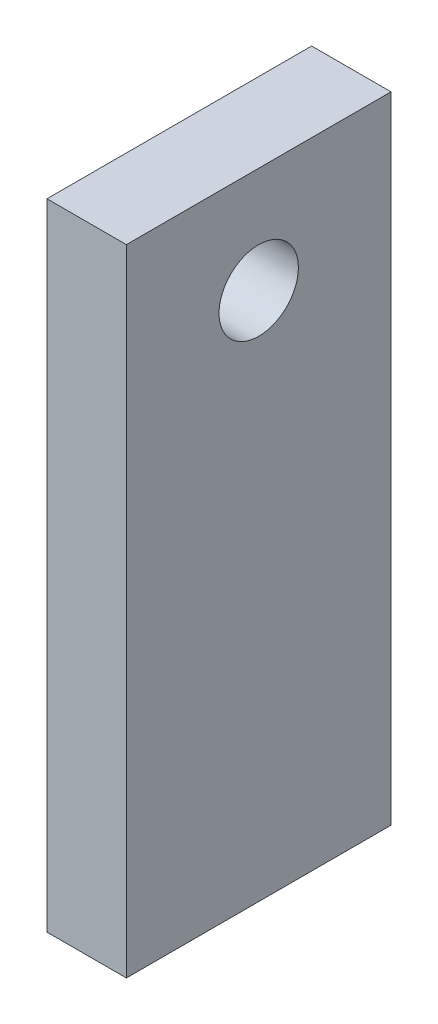
ISO-10303-21;
HEADER;
FILE_DESCRIPTION(('STEP AP214'),'2;1');
FILE_NAME('part.step','',(''),(''),'','','');
FILE_SCHEMA(('AUTOMOTIVE_DESIGN { 1 0 10303 214 1 1 1 1 }'));
ENDSEC;
DATA;
#1=APPLICATION_CONTEXT('core data for automotive mechanical design processes');
#2=APPLICATION_PROTOCOL_DEFINITION('international standard','automotive_design',2000,#1);
#3=PRODUCT_CONTEXT('',#1,'mechanical');
#4=PRODUCT('Part','Part','',(#3));
#5=PRODUCT_RELATED_PRODUCT_CATEGORY('part','',(#4));
#6=PRODUCT_DEFINITION_FORMATION('','',#4);
#7=PRODUCT_DEFINITION_CONTEXT('part definition',#1,'design');
#8=PRODUCT_DEFINITION('design','',#6,#7);
#9=PRODUCT_DEFINITION_SHAPE('','',#8);
#10=(LENGTH_UNIT() NAMED_UNIT(*) SI_UNIT(.MILLI.,.METRE.));
#11=(NAMED_UNIT(*) PLANE_ANGLE_UNIT() SI_UNIT($,.RADIAN.));
#12=(NAMED_UNIT(*) SI_UNIT($,.STERADIAN.) SOLID_ANGLE_UNIT());
#13=UNCERTAINTY_MEASURE_WITH_UNIT(LENGTH_MEASURE(1.E-05),#10,'distance_accuracy_value','');
#14=(GEOMETRIC_REPRESENTATION_CONTEXT(3) GLOBAL_UNCERTAINTY_ASSIGNED_CONTEXT((#13)) GLOBAL_UNIT_ASSIGNED_CONTEXT((#10,
#11,#12)) REPRESENTATION_CONTEXT('',''));
#15=CARTESIAN_POINT('',(0.,0.,0.));
#16=DIRECTION('',(0.,0.,1.));
#17=DIRECTION('',(1.,0.,0.));
#18=AXIS2_PLACEMENT_3D('',#15,#16,#17);
#19=CARTESIAN_POINT('',(15.,60.,-25.));
#20=DIRECTION('',(0.,0.,1.));
#21=DIRECTION('',(0.,-1.,0.));
#22=AXIS2_PLACEMENT_3D('',#19,#20,#21);
#23=PLANE('',#22);
#24=DIRECTION('',(0.,1.,0.));
#25=VECTOR('',#24,1.);
#26=CARTESIAN_POINT('',(0.,60.,-25.));
#27=LINE('',#26,#25);
#28=CARTESIAN_POINT('',(0.,-60.,-25.));
#29=VERTEX_POINT('',#28);
#30=CARTESIAN_POINT('',(0.,60.,-25.));
#31=VERTEX_POINT('',#30);
#32=EDGE_CURVE('E105',#29,#31,#27,.T.);
#33=ORIENTED_EDGE('',*,*,#32,.T.);
#34=DIRECTION('',(-1.,0.,0.));
#35=VECTOR('',#34,1.);
#36=CARTESIAN_POINT('',(15.,60.,-25.));
#37=LINE('',#36,#35);
#38=CARTESIAN_POINT('',(15.,60.,-25.));
#39=VERTEX_POINT('',#38);
#40=EDGE_CURVE('E11',#39,#31,#37,.T.);
#41=ORIENTED_EDGE('',*,*,#40,.F.);
#42=DIRECTION('',(0.,1.,0.));
#43=VECTOR('',#42,1.);
#44=CARTESIAN_POINT('',(15.,60.,-25.));
#45=LINE('',#44,#43);
#46=CARTESIAN_POINT('',(15.,-60.,-25.));
#47=VERTEX_POINT('',#46);
#48=EDGE_CURVE('E93',#47,#39,#45,.T.);
#49=ORIENTED_EDGE('',*,*,#48,.F.);
#50=DIRECTION('',(-1.,0.,0.));
#51=VECTOR('',#50,1.);
#52=CARTESIAN_POINT('',(15.,-60.,-25.));
#53=LINE('',#52,#51);
#54=EDGE_CURVE('E101',#47,#29,#53,.T.);
#55=ORIENTED_EDGE('',*,*,#54,.T.);
#56=EDGE_LOOP('',(#33,#41,#49,#55));
#57=FACE_BOUND('',#56,.T.);
#58=ADVANCED_FACE('F42',(#57),#23,.F.);
#59=CARTESIAN_POINT('',(15.,60.,25.));
#60=DIRECTION('',(0.,-1.,0.));
#61=DIRECTION('',(0.,0.,-1.));
#62=AXIS2_PLACEMENT_3D('',#59,#60,#61);
#63=PLANE('',#62);
#64=DIRECTION('',(0.,0.,1.));
#65=VECTOR('',#64,1.);
#66=CARTESIAN_POINT('',(0.,60.,25.));
#67=LINE('',#66,#65);
#68=CARTESIAN_POINT('',(0.,60.,25.));
#69=VERTEX_POINT('',#68);
#70=EDGE_CURVE('E97',#31,#69,#67,.T.);
#71=ORIENTED_EDGE('',*,*,#70,.T.);
#72=DIRECTION('',(-1.,0.,0.));
#73=VECTOR('',#72,1.);
#74=CARTESIAN_POINT('',(15.,60.,25.));
#75=LINE('',#74,#73);
#76=CARTESIAN_POINT('',(15.,60.,25.));
#77=VERTEX_POINT('',#76);
#78=EDGE_CURVE('E50',#77,#69,#75,.T.);
#79=ORIENTED_EDGE('',*,*,#78,.F.);
#80=DIRECTION('',(0.,0.,1.));
#81=VECTOR('',#80,1.);
#82=CARTESIAN_POINT('',(15.,60.,25.));
#83=LINE('',#82,#81);
#84=EDGE_CURVE('E88',#39,#77,#83,.T.);
#85=ORIENTED_EDGE('',*,*,#84,.F.);
#86=ORIENTED_EDGE('',*,*,#40,.T.);
#87=EDGE_LOOP('',(#71,#79,#85,#86));
#88=FACE_BOUND('',#87,.T.);
#89=ADVANCED_FACE('F96',(#88),#63,.F.);
#90=CARTESIAN_POINT('',(15.,60.,25.));
#91=DIRECTION('',(0.,0.,-1.));
#92=DIRECTION('',(0.,1.,0.));
#93=AXIS2_PLACEMENT_3D('',#90,#91,#92);
#94=PLANE('',#93);
#95=DIRECTION('',(0.,-1.,0.));
#96=VECTOR('',#95,1.);
#97=CARTESIAN_POINT('',(0.,60.,25.));
#98=LINE('',#97,#96);
#99=CARTESIAN_POINT('',(0.,-60.,25.));
#100=VERTEX_POINT('',#99);
#101=EDGE_CURVE('E75',#69,#100,#98,.T.);
#102=ORIENTED_EDGE('',*,*,#101,.T.);
#103=DIRECTION('',(-1.,0.,0.));
#104=VECTOR('',#103,1.);
#105=CARTESIAN_POINT('',(15.,-60.,25.));
#106=LINE('',#105,#104);
#107=CARTESIAN_POINT('',(15.,-60.,25.));
#108=VERTEX_POINT('',#107);
#109=EDGE_CURVE('E98',#108,#100,#106,.T.);
#110=ORIENTED_EDGE('',*,*,#109,.F.);
#111=DIRECTION('',(0.,-1.,0.));
#112=VECTOR('',#111,1.);
#113=CARTESIAN_POINT('',(15.,60.,25.));
#114=LINE('',#113,#112);
#115=EDGE_CURVE('E91',#77,#108,#114,.T.);
#116=ORIENTED_EDGE('',*,*,#115,.F.);
#117=ORIENTED_EDGE('',*,*,#78,.T.);
#118=EDGE_LOOP('',(#102,#110,#116,#117));
#119=FACE_BOUND('',#118,.T.);
#120=ADVANCED_FACE('F99',(#119),#94,.F.);
#121=CARTESIAN_POINT('',(15.,-60.,25.));
#122=DIRECTION('',(0.,1.,0.));
#123=DIRECTION('',(0.,0.,1.));
#124=AXIS2_PLACEMENT_3D('',#121,#122,#123);
#125=PLANE('',#124);
#126=DIRECTION('',(0.,0.,-1.));
#127=VECTOR('',#126,1.);
#128=CARTESIAN_POINT('',(0.,-60.,25.));
#129=LINE('',#128,#127);
#130=EDGE_CURVE('E81',#100,#29,#129,.T.);
#131=ORIENTED_EDGE('',*,*,#130,.T.);
#132=ORIENTED_EDGE('',*,*,#54,.F.);
#133=DIRECTION('',(0.,0.,-1.));
#134=VECTOR('',#133,1.);
#135=CARTESIAN_POINT('',(15.,-60.,25.));
#136=LINE('',#135,#134);
#137=EDGE_CURVE('E58',#108,#47,#136,.T.);
#138=ORIENTED_EDGE('',*,*,#137,.F.);
#139=ORIENTED_EDGE('',*,*,#109,.T.);
#140=EDGE_LOOP('',(#131,#132,#138,#139));
#141=FACE_BOUND('',#140,.T.);
#142=ADVANCED_FACE('F113',(#141),#125,.F.);
#143=CARTESIAN_POINT('',(15.,0.,0.));
#144=DIRECTION('',(1.,0.,0.));
#145=DIRECTION('',(0.,0.,-1.));
#146=AXIS2_PLACEMENT_3D('',#143,#144,#145);
#147=PLANE('',#146);
#148=CARTESIAN_POINT('',(15.,40.,0.));
#149=DIRECTION('',(1.,0.,0.));
#150=DIRECTION('',(0.,0.,-1.));
#151=AXIS2_PLACEMENT_3D('',#148,#149,#150);
#152=CIRCLE('',#151,7.5);
#153=CARTESIAN_POINT('',(15.,40.,-7.5));
#154=VERTEX_POINT('',#153);
#155=EDGE_CURVE('E121',#154,#154,#152,.T.);
#156=ORIENTED_EDGE('',*,*,#155,.F.);
#157=EDGE_LOOP('',(#156));
#158=FACE_BOUND('',#157,.T.);
#159=ORIENTED_EDGE('',*,*,#48,.T.);
#160=ORIENTED_EDGE('',*,*,#84,.T.);
#161=ORIENTED_EDGE('',*,*,#115,.T.);
#162=ORIENTED_EDGE('',*,*,#137,.T.);
#163=EDGE_LOOP('',(#159,#160,#161,#162));
#164=FACE_BOUND('',#163,.T.);
#165=ADVANCED_FACE('F89',(#158,#164),#147,.T.);
#166=CARTESIAN_POINT('',(0.,0.,0.));
#167=DIRECTION('',(1.,0.,0.));
#168=DIRECTION('',(0.,0.,-1.));
#169=AXIS2_PLACEMENT_3D('',#166,#167,#168);
#170=PLANE('',#169);
#171=CARTESIAN_POINT('',(0.,40.,0.));
#172=DIRECTION('',(1.,0.,0.));
#173=DIRECTION('',(0.,0.,-1.));
#174=AXIS2_PLACEMENT_3D('',#171,#172,#173);
#175=CIRCLE('',#174,7.5);
#176=CARTESIAN_POINT('',(0.,40.,-7.5));
#177=VERTEX_POINT('',#176);
#178=EDGE_CURVE('E108',#177,#177,#175,.F.);
#179=ORIENTED_EDGE('',*,*,#178,.F.);
#180=EDGE_LOOP('',(#179));
#181=FACE_BOUND('',#180,.T.);
#182=ORIENTED_EDGE('',*,*,#32,.F.);
#183=ORIENTED_EDGE('',*,*,#130,.F.);
#184=ORIENTED_EDGE('',*,*,#101,.F.);
#185=ORIENTED_EDGE('',*,*,#70,.F.);
#186=EDGE_LOOP('',(#182,#183,#184,#185));
#187=FACE_BOUND('',#186,.T.);
#188=ADVANCED_FACE('F116',(#181,#187),#170,.F.);
#189=CARTESIAN_POINT('',(-0.000999999999999265,40.,0.));
#190=DIRECTION('',(1.,0.,0.));
#191=DIRECTION('',(0.,0.,-1.));
#192=AXIS2_PLACEMENT_3D('',#189,#190,#191);
#193=CYLINDRICAL_SURFACE('',#192,7.5);
#194=CARTESIAN_POINT('',(15.,40.,-7.5));
#195=CARTESIAN_POINT('',(14.84375,40.,-7.5));
#196=CARTESIAN_POINT('',(14.6875,40.,-7.5));
#197=CARTESIAN_POINT('',(14.375,40.,-7.5));
#198=CARTESIAN_POINT('',(14.21875,40.,-7.5));
#199=CARTESIAN_POINT('',(13.90625,40.,-7.5));
#200=CARTESIAN_POINT('',(13.75,40.,-7.5));
#201=CARTESIAN_POINT('',(13.4375,40.,-7.5));
#202=CARTESIAN_POINT('',(13.28125,40.,-7.5));
#203=CARTESIAN_POINT('',(12.96875,40.,-7.5));
#204=CARTESIAN_POINT('',(12.8125,40.,-7.5));
#205=CARTESIAN_POINT('',(12.5,40.,-7.5));
#206=CARTESIAN_POINT('',(12.34375,40.,-7.5));
#207=CARTESIAN_POINT('',(12.03125,40.,-7.5));
#208=CARTESIAN_POINT('',(11.875,40.,-7.5));
#209=CARTESIAN_POINT('',(11.5625,40.,-7.5));
#210=CARTESIAN_POINT('',(11.40625,40.,-7.5));
#211=CARTESIAN_POINT('',(11.09375,40.,-7.5));
#212=CARTESIAN_POINT('',(10.9375,40.,-7.5));
#213=CARTESIAN_POINT('',(10.625,40.,-7.5));
#214=CARTESIAN_POINT('',(10.46875,40.,-7.5));
#215=CARTESIAN_POINT('',(10.15625,40.,-7.5));
#216=CARTESIAN_POINT('',(10.,40.,-7.5));
#217=CARTESIAN_POINT('',(9.6875,40.,-7.5));
#218=CARTESIAN_POINT('',(9.53125,40.,-7.5));
#219=CARTESIAN_POINT('',(9.21875,40.,-7.5));
#220=CARTESIAN_POINT('',(9.0625,40.,-7.5));
#221=CARTESIAN_POINT('',(8.75,40.,-7.5));
#222=CARTESIAN_POINT('',(8.59375,40.,-7.5));
#223=CARTESIAN_POINT('',(8.28125,40.,-7.5));
#224=CARTESIAN_POINT('',(8.125,40.,-7.5));
#225=CARTESIAN_POINT('',(7.8125,40.,-7.5));
#226=CARTESIAN_POINT('',(7.65625,40.,-7.5));
#227=CARTESIAN_POINT('',(7.34375,40.,-7.5));
#228=CARTESIAN_POINT('',(7.1875,40.,-7.5));
#229=CARTESIAN_POINT('',(6.875,40.,-7.5));
#230=CARTESIAN_POINT('',(6.71875,40.,-7.5));
#231=CARTESIAN_POINT('',(6.40625,40.,-7.5));
#232=CARTESIAN_POINT('',(6.25,40.,-7.5));
#233=CARTESIAN_POINT('',(5.9375,40.,-7.5));
#234=CARTESIAN_POINT('',(5.78125,40.,-7.5));
#235=CARTESIAN_POINT('',(5.46875,40.,-7.5));
#236=CARTESIAN_POINT('',(5.3125,40.,-7.5));
#237=CARTESIAN_POINT('',(5.,40.,-7.5));
#238=CARTESIAN_POINT('',(4.84375,40.,-7.5));
#239=CARTESIAN_POINT('',(4.53125,40.,-7.5));
#240=CARTESIAN_POINT('',(4.375,40.,-7.5));
#241=CARTESIAN_POINT('',(4.0625,40.,-7.5));
#242=CARTESIAN_POINT('',(3.90625,40.,-7.5));
#243=CARTESIAN_POINT('',(3.59375,40.,-7.5));
#244=CARTESIAN_POINT('',(3.4375,40.,-7.5));
#245=CARTESIAN_POINT('',(3.125,40.,-7.5));
#246=CARTESIAN_POINT('',(2.96875,40.,-7.5));
#247=CARTESIAN_POINT('',(2.65625,40.,-7.5));
#248=CARTESIAN_POINT('',(2.5,40.,-7.5));
#249=CARTESIAN_POINT('',(2.1875,40.,-7.5));
#250=CARTESIAN_POINT('',(2.03125,40.,-7.5));
#251=CARTESIAN_POINT('',(1.71875,40.,-7.5));
#252=CARTESIAN_POINT('',(1.5625,40.,-7.5));
#253=CARTESIAN_POINT('',(1.25,40.,-7.5));
#254=CARTESIAN_POINT('',(1.09375,40.,-7.5));
#255=CARTESIAN_POINT('',(0.781250000000001,40.,-7.5));
#256=CARTESIAN_POINT('',(0.625,40.,-7.5));
#257=CARTESIAN_POINT('',(0.3125,40.,-7.5));
#258=CARTESIAN_POINT('',(0.15625,40.,-7.5));
#259=CARTESIAN_POINT('',(0.,40.,-7.5));
#260=B_SPLINE_CURVE_WITH_KNOTS('',3,(#194,#195,#196,#197,#198,#199,#200,#201,#202,#203,#204,
#205,#206,#207,#208,#209,#210,#211,#212,#213,#214,#215,#216,#217,#218,#219,#220,#221,#222,#223,
#224,#225,#226,#227,#228,#229,#230,#231,#232,#233,#234,#235,#236,#237,#238,#239,#240,#241,#242,
#243,#244,#245,#246,#247,#248,#249,#250,#251,#252,#253,#254,#255,#256,#257,#258,#259),
.UNSPECIFIED.,.F.,.F.,(4,2,2,2,2,2,2,2,2,2,2,2,2,2,2,2,2,2,2,2,2,2,2,2,2,2,2,2,2,2,2,2,4),(0.,
0.46875,0.937500000000001,1.40625,1.875,2.34375,2.8125,3.28125,3.75,4.21875,4.6875,5.15625,
5.625,6.09375,6.5625,7.03125,7.5,7.96875,8.4375,8.90625,9.375,9.84375,10.3125,10.78125,11.25,
11.71875,12.1875,12.65625,13.125,13.59375,14.0625,14.53125,15.),.UNSPECIFIED.);
#261=EDGE_CURVE('BSEAM125',#154,#177,#260,.T.);
#262=ORIENTED_EDGE('',*,*,#155,.T.);
#263=ORIENTED_EDGE('',*,*,#178,.T.);
#264=ORIENTED_EDGE('',*,*,#261,.T.);
#265=ORIENTED_EDGE('',*,*,#261,.F.);
#266=EDGE_LOOP('',(#262,#264,#263,#265));
#267=FACE_BOUND('',#266,.T.);
#268=ADVANCED_FACE('F125',(#267),#193,.F.);
#269=CLOSED_SHELL('',(#58,#89,#120,#142,#165,#188,#268));
#270=MANIFOLD_SOLID_BREP('B2',#269);
#271=ADVANCED_BREP_SHAPE_REPRESENTATION('',(#18,#270),#14);
#272=SHAPE_DEFINITION_REPRESENTATION(#9,#271);
ENDSEC;
END-ISO-10303-21;
